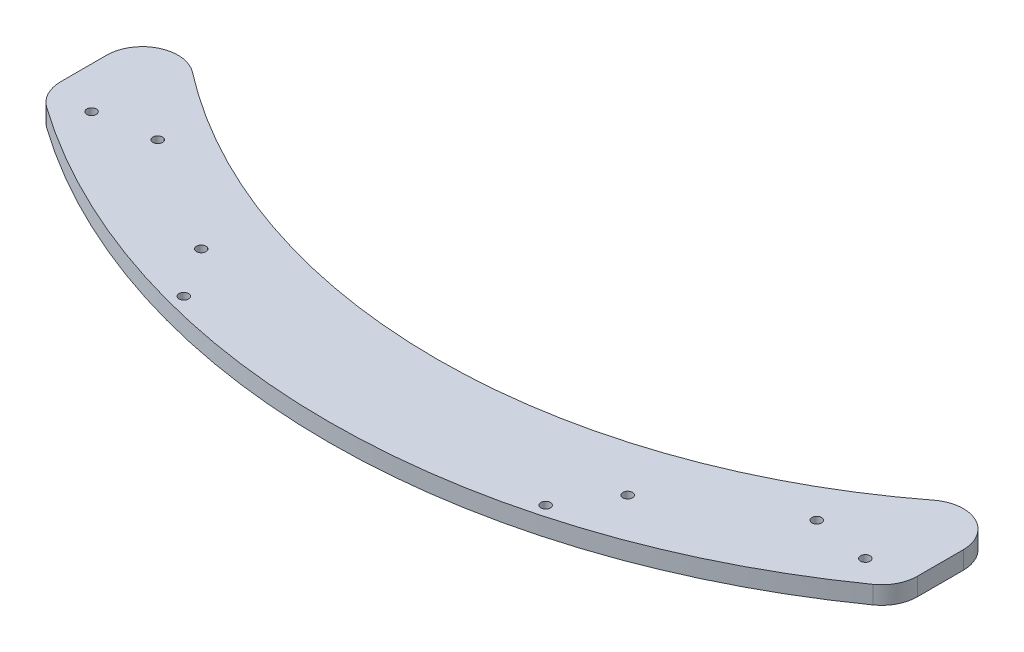
ISO-10303-21;
HEADER;
FILE_DESCRIPTION(('STEP AP214'),'2;1');
FILE_NAME('part.step','',(''),(''),'','','');
FILE_SCHEMA(('AUTOMOTIVE_DESIGN { 1 0 10303 214 1 1 1 1 }'));
ENDSEC;
DATA;
#1=APPLICATION_CONTEXT('core data for automotive mechanical design processes');
#2=APPLICATION_PROTOCOL_DEFINITION('international standard','automotive_design',2000,#1);
#3=PRODUCT_CONTEXT('',#1,'mechanical');
#4=PRODUCT('Part','Part','',(#3));
#5=PRODUCT_RELATED_PRODUCT_CATEGORY('part','',(#4));
#6=PRODUCT_DEFINITION_FORMATION('','',#4);
#7=PRODUCT_DEFINITION_CONTEXT('part definition',#1,'design');
#8=PRODUCT_DEFINITION('design','',#6,#7);
#9=PRODUCT_DEFINITION_SHAPE('','',#8);
#10=(LENGTH_UNIT() NAMED_UNIT(*) SI_UNIT(.MILLI.,.METRE.));
#11=(NAMED_UNIT(*) PLANE_ANGLE_UNIT() SI_UNIT($,.RADIAN.));
#12=(NAMED_UNIT(*) SI_UNIT($,.STERADIAN.) SOLID_ANGLE_UNIT());
#13=UNCERTAINTY_MEASURE_WITH_UNIT(LENGTH_MEASURE(1.E-05),#10,'distance_accuracy_value','');
#14=(GEOMETRIC_REPRESENTATION_CONTEXT(3) GLOBAL_UNCERTAINTY_ASSIGNED_CONTEXT((#13)) GLOBAL_UNIT_ASSIGNED_CONTEXT((#10,
#11,#12)) REPRESENTATION_CONTEXT('',''));
#15=CARTESIAN_POINT('',(0.,0.,0.));
#16=DIRECTION('',(0.,0.,1.));
#17=DIRECTION('',(1.,0.,0.));
#18=AXIS2_PLACEMENT_3D('',#15,#16,#17);
#19=CARTESIAN_POINT('',(139.7,6.35,78.9510702183531));
#20=DIRECTION('',(0.,-1.,0.));
#21=DIRECTION('',(0.,0.,-1.));
#22=AXIS2_PLACEMENT_3D('',#19,#20,#21);
#23=PLANE('',#22);
#24=CARTESIAN_POINT('',(-64.3738884932155,6.35,139.521467890965));
#25=DIRECTION('',(0.,1.,0.));
#26=DIRECTION('',(0.,0.,-1.));
#27=AXIS2_PLACEMENT_3D('',#24,#25,#26);
#28=CIRCLE('',#27,1.70053000000001);
#29=CARTESIAN_POINT('',(-64.3738884932155,6.35,137.820937890965));
#30=VERTEX_POINT('',#29);
#31=EDGE_CURVE('E212',#30,#30,#28,.T.);
#32=ORIENTED_EDGE('',*,*,#31,.F.);
#33=EDGE_LOOP('',(#32));
#34=FACE_BOUND('',#33,.T.);
#35=CARTESIAN_POINT('',(-117.248460029199,6.35,95.9258461633713));
#36=DIRECTION('',(0.,1.,0.));
#37=DIRECTION('',(0.,0.,-1.));
#38=AXIS2_PLACEMENT_3D('',#35,#36,#37);
#39=CIRCLE('',#38,1.70053000000001);
#40=CARTESIAN_POINT('',(-117.248460029199,6.35,94.2253161633713));
#41=VERTEX_POINT('',#40);
#42=EDGE_CURVE('E200',#41,#41,#39,.T.);
#43=ORIENTED_EDGE('',*,*,#42,.F.);
#44=EDGE_LOOP('',(#43));
#45=FACE_BOUND('',#44,.T.);
#46=CARTESIAN_POINT('',(64.3738884932155,6.35,139.521467890965));
#47=DIRECTION('',(0.,1.,0.));
#48=DIRECTION('',(0.,0.,1.));
#49=AXIS2_PLACEMENT_3D('',#46,#47,#48);
#50=CIRCLE('',#49,1.70053000000001);
#51=CARTESIAN_POINT('',(64.3738884932155,6.35,141.221997890965));
#52=VERTEX_POINT('',#51);
#53=EDGE_CURVE('E188',#52,#52,#50,.T.);
#54=ORIENTED_EDGE('',*,*,#53,.F.);
#55=EDGE_LOOP('',(#54));
#56=FACE_BOUND('',#55,.T.);
#57=CARTESIAN_POINT('',(117.248460029199,6.35,95.9258461633713));
#58=DIRECTION('',(0.,1.,0.));
#59=DIRECTION('',(0.,0.,1.));
#60=AXIS2_PLACEMENT_3D('',#57,#58,#59);
#61=CIRCLE('',#60,1.70053000000001);
#62=CARTESIAN_POINT('',(117.248460029199,6.35,97.6263761633713));
#63=VERTEX_POINT('',#62);
#64=EDGE_CURVE('E134',#63,#63,#61,.T.);
#65=ORIENTED_EDGE('',*,*,#64,.F.);
#66=EDGE_LOOP('',(#65));
#67=FACE_BOUND('',#66,.T.);
#68=CARTESIAN_POINT('',(139.7,6.35,78.9510702183531));
#69=DIRECTION('',(0.,1.,0.));
#70=DIRECTION('',(0.,0.,-1.));
#71=AXIS2_PLACEMENT_3D('',#68,#69,#70);
#72=CIRCLE('',#71,12.7);
#73=CARTESIAN_POINT('',(152.4,6.35,78.9510702183531));
#74=VERTEX_POINT('',#73);
#75=CARTESIAN_POINT('',(131.945714909282,6.35,68.8931846188913));
#76=VERTEX_POINT('',#75);
#77=EDGE_CURVE('E145',#74,#76,#72,.T.);
#78=ORIENTED_EDGE('',*,*,#77,.T.);
#79=CARTESIAN_POINT('',(0.,6.35,-102.25024));
#80=DIRECTION('',(0.,-1.,0.));
#81=DIRECTION('',(0.,0.,1.));
#82=AXIS2_PLACEMENT_3D('',#79,#80,#81);
#83=CIRCLE('',#82,216.101234316705);
#84=CARTESIAN_POINT('',(-131.945714909282,6.35,68.8931846188912));
#85=VERTEX_POINT('',#84);
#86=EDGE_CURVE('E93',#76,#85,#83,.T.);
#87=ORIENTED_EDGE('',*,*,#86,.T.);
#88=CARTESIAN_POINT('',(-139.7,6.35,78.9510702183531));
#89=DIRECTION('',(0.,1.,0.));
#90=DIRECTION('',(0.,0.,1.));
#91=AXIS2_PLACEMENT_3D('',#88,#89,#90);
#92=CIRCLE('',#91,12.7);
#93=CARTESIAN_POINT('',(-152.4,6.35,78.9510702183531));
#94=VERTEX_POINT('',#93);
#95=EDGE_CURVE('E160',#85,#94,#92,.T.);
#96=ORIENTED_EDGE('',*,*,#95,.T.);
#97=DIRECTION('',(0.,0.,1.));
#98=VECTOR('',#97,1.);
#99=CARTESIAN_POINT('',(-152.4,6.35,78.9510702183531));
#100=LINE('',#99,#98);
#101=CARTESIAN_POINT('',(-152.4,6.35,95.2942578632854));
#102=VERTEX_POINT('',#101);
#103=EDGE_CURVE('E173',#94,#102,#100,.T.);
#104=ORIENTED_EDGE('',*,*,#103,.T.);
#105=CARTESIAN_POINT('',(-139.7,6.35,95.2942578632855));
#106=DIRECTION('',(0.,1.,0.));
#107=DIRECTION('',(0.,0.,-1.));
#108=AXIS2_PLACEMENT_3D('',#105,#106,#107);
#109=CIRCLE('',#108,12.7);
#110=CARTESIAN_POINT('',(-147.032871420173,6.35,105.663394603401));
#111=VERTEX_POINT('',#110);
#112=EDGE_CURVE('E112',#102,#111,#109,.T.);
#113=ORIENTED_EDGE('',*,*,#112,.T.);
#114=CARTESIAN_POINT('',(0.,6.35,-102.25024));
#115=DIRECTION('',(0.,1.,0.));
#116=DIRECTION('',(0.,0.,1.));
#117=AXIS2_PLACEMENT_3D('',#114,#115,#116);
#118=CIRCLE('',#117,254.65024);
#119=CARTESIAN_POINT('',(147.032871420173,6.35,105.663394603401));
#120=VERTEX_POINT('',#119);
#121=EDGE_CURVE('E106',#111,#120,#118,.T.);
#122=ORIENTED_EDGE('',*,*,#121,.T.);
#123=CARTESIAN_POINT('',(139.7,6.35,95.2942578632854));
#124=DIRECTION('',(0.,1.,0.));
#125=DIRECTION('',(0.,0.,-1.));
#126=AXIS2_PLACEMENT_3D('',#123,#124,#125);
#127=CIRCLE('',#126,12.7);
#128=CARTESIAN_POINT('',(152.4,6.35,95.2942578632854));
#129=VERTEX_POINT('',#128);
#130=EDGE_CURVE('E110',#120,#129,#127,.T.);
#131=ORIENTED_EDGE('',*,*,#130,.T.);
#132=DIRECTION('',(0.,0.,-1.));
#133=VECTOR('',#132,1.);
#134=CARTESIAN_POINT('',(152.4,6.35,78.9510702183531));
#135=LINE('',#134,#133);
#136=EDGE_CURVE('E50',#129,#74,#135,.T.);
#137=ORIENTED_EDGE('',*,*,#136,.T.);
#138=EDGE_LOOP('',(#78,#87,#96,#104,#113,#122,#131,#137));
#139=FACE_BOUND('',#138,.T.);
#140=CARTESIAN_POINT('',(137.667738302992,6.35,99.0669824669048));
#141=DIRECTION('',(0.,1.,0.));
#142=DIRECTION('',(0.,0.,1.));
#143=AXIS2_PLACEMENT_3D('',#140,#141,#142);
#144=CIRCLE('',#143,1.70052999999999);
#145=CARTESIAN_POINT('',(137.667738302992,6.35,100.767512466905));
#146=VERTEX_POINT('',#145);
#147=EDGE_CURVE('E182',#146,#146,#144,.T.);
#148=ORIENTED_EDGE('',*,*,#147,.F.);
#149=EDGE_LOOP('',(#148));
#150=FACE_BOUND('',#149,.T.);
#151=CARTESIAN_POINT('',(75.8677338588999,6.35,121.822498112795));
#152=DIRECTION('',(0.,1.,0.));
#153=DIRECTION('',(0.,0.,1.));
#154=AXIS2_PLACEMENT_3D('',#151,#152,#153);
#155=CIRCLE('',#154,1.70052999999999);
#156=CARTESIAN_POINT('',(75.8677338588999,6.35,123.523028112795));
#157=VERTEX_POINT('',#156);
#158=EDGE_CURVE('E194',#157,#157,#155,.T.);
#159=ORIENTED_EDGE('',*,*,#158,.F.);
#160=EDGE_LOOP('',(#159));
#161=FACE_BOUND('',#160,.T.);
#162=CARTESIAN_POINT('',(-137.667738302992,6.35,99.0669824669048));
#163=DIRECTION('',(0.,1.,0.));
#164=DIRECTION('',(0.,0.,-1.));
#165=AXIS2_PLACEMENT_3D('',#162,#163,#164);
#166=CIRCLE('',#165,1.70052999999999);
#167=CARTESIAN_POINT('',(-137.667738302992,6.35,97.3664524669048));
#168=VERTEX_POINT('',#167);
#169=EDGE_CURVE('E206',#168,#168,#166,.T.);
#170=ORIENTED_EDGE('',*,*,#169,.F.);
#171=EDGE_LOOP('',(#170));
#172=FACE_BOUND('',#171,.T.);
#173=CARTESIAN_POINT('',(-75.8677338588999,6.35,121.822498112795));
#174=DIRECTION('',(0.,1.,0.));
#175=DIRECTION('',(0.,0.,-1.));
#176=AXIS2_PLACEMENT_3D('',#173,#174,#175);
#177=CIRCLE('',#176,1.70052999999999);
#178=CARTESIAN_POINT('',(-75.8677338588999,6.35,120.121968112795));
#179=VERTEX_POINT('',#178);
#180=EDGE_CURVE('E218',#179,#179,#177,.T.);
#181=ORIENTED_EDGE('',*,*,#180,.F.);
#182=EDGE_LOOP('',(#181));
#183=FACE_BOUND('',#182,.T.);
#184=ADVANCED_FACE('F33',(#34,#45,#56,#67,#139,#150,#161,#172,#183),#23,.F.);
#185=CARTESIAN_POINT('',(139.7,0.,78.9510702183531));
#186=DIRECTION('',(0.,-1.,0.));
#187=DIRECTION('',(0.,0.,-1.));
#188=AXIS2_PLACEMENT_3D('',#185,#186,#187);
#189=PLANE('',#188);
#190=CARTESIAN_POINT('',(-64.3738884932155,0.,139.521467890965));
#191=DIRECTION('',(0.,1.,0.));
#192=DIRECTION('',(0.,0.,-1.));
#193=AXIS2_PLACEMENT_3D('',#190,#191,#192);
#194=CIRCLE('',#193,1.70053000000001);
#195=CARTESIAN_POINT('',(-64.3738884932155,0.,137.820937890965));
#196=VERTEX_POINT('',#195);
#197=EDGE_CURVE('E215',#196,#196,#194,.T.);
#198=ORIENTED_EDGE('',*,*,#197,.T.);
#199=EDGE_LOOP('',(#198));
#200=FACE_BOUND('',#199,.T.);
#201=CARTESIAN_POINT('',(-117.248460029199,0.,95.9258461633713));
#202=DIRECTION('',(0.,1.,0.));
#203=DIRECTION('',(0.,0.,-1.));
#204=AXIS2_PLACEMENT_3D('',#201,#202,#203);
#205=CIRCLE('',#204,1.70053000000001);
#206=CARTESIAN_POINT('',(-117.248460029199,0.,94.2253161633713));
#207=VERTEX_POINT('',#206);
#208=EDGE_CURVE('E203',#207,#207,#205,.T.);
#209=ORIENTED_EDGE('',*,*,#208,.T.);
#210=EDGE_LOOP('',(#209));
#211=FACE_BOUND('',#210,.T.);
#212=CARTESIAN_POINT('',(64.3738884932155,0.,139.521467890965));
#213=DIRECTION('',(0.,1.,0.));
#214=DIRECTION('',(0.,0.,1.));
#215=AXIS2_PLACEMENT_3D('',#212,#213,#214);
#216=CIRCLE('',#215,1.70053000000001);
#217=CARTESIAN_POINT('',(64.3738884932155,0.,141.221997890965));
#218=VERTEX_POINT('',#217);
#219=EDGE_CURVE('E191',#218,#218,#216,.T.);
#220=ORIENTED_EDGE('',*,*,#219,.T.);
#221=EDGE_LOOP('',(#220));
#222=FACE_BOUND('',#221,.T.);
#223=CARTESIAN_POINT('',(117.248460029199,0.,95.9258461633713));
#224=DIRECTION('',(0.,1.,0.));
#225=DIRECTION('',(0.,0.,1.));
#226=AXIS2_PLACEMENT_3D('',#223,#224,#225);
#227=CIRCLE('',#226,1.70053000000001);
#228=CARTESIAN_POINT('',(117.248460029199,0.,97.6263761633713));
#229=VERTEX_POINT('',#228);
#230=EDGE_CURVE('E179',#229,#229,#227,.T.);
#231=ORIENTED_EDGE('',*,*,#230,.T.);
#232=EDGE_LOOP('',(#231));
#233=FACE_BOUND('',#232,.T.);
#234=CARTESIAN_POINT('',(139.7,0.,78.9510702183531));
#235=DIRECTION('',(0.,1.,0.));
#236=DIRECTION('',(0.,0.,-1.));
#237=AXIS2_PLACEMENT_3D('',#234,#235,#236);
#238=CIRCLE('',#237,12.7);
#239=CARTESIAN_POINT('',(152.4,0.,78.9510702183531));
#240=VERTEX_POINT('',#239);
#241=CARTESIAN_POINT('',(131.945714909282,0.,68.8931846188913));
#242=VERTEX_POINT('',#241);
#243=EDGE_CURVE('E130',#240,#242,#238,.T.);
#244=ORIENTED_EDGE('',*,*,#243,.F.);
#245=DIRECTION('',(0.,0.,-1.));
#246=VECTOR('',#245,1.);
#247=CARTESIAN_POINT('',(152.4,0.,78.9510702183531));
#248=LINE('',#247,#246);
#249=CARTESIAN_POINT('',(152.4,0.,95.2942578632854));
#250=VERTEX_POINT('',#249);
#251=EDGE_CURVE('E85',#250,#240,#248,.T.);
#252=ORIENTED_EDGE('',*,*,#251,.F.);
#253=CARTESIAN_POINT('',(139.7,0.,95.2942578632854));
#254=DIRECTION('',(0.,1.,0.));
#255=DIRECTION('',(0.,0.,-1.));
#256=AXIS2_PLACEMENT_3D('',#253,#254,#255);
#257=CIRCLE('',#256,12.7);
#258=CARTESIAN_POINT('',(147.032871420173,0.,105.663394603401));
#259=VERTEX_POINT('',#258);
#260=EDGE_CURVE('E79',#259,#250,#257,.T.);
#261=ORIENTED_EDGE('',*,*,#260,.F.);
#262=CARTESIAN_POINT('',(0.,0.,-102.25024));
#263=DIRECTION('',(0.,1.,0.));
#264=DIRECTION('',(0.,0.,1.));
#265=AXIS2_PLACEMENT_3D('',#262,#263,#264);
#266=CIRCLE('',#265,254.65024);
#267=CARTESIAN_POINT('',(-147.032871420173,0.,105.663394603401));
#268=VERTEX_POINT('',#267);
#269=EDGE_CURVE('E120',#268,#259,#266,.T.);
#270=ORIENTED_EDGE('',*,*,#269,.F.);
#271=CARTESIAN_POINT('',(-139.7,0.,95.2942578632855));
#272=DIRECTION('',(0.,1.,0.));
#273=DIRECTION('',(0.,0.,-1.));
#274=AXIS2_PLACEMENT_3D('',#271,#272,#273);
#275=CIRCLE('',#274,12.7);
#276=CARTESIAN_POINT('',(-152.4,0.,95.2942578632854));
#277=VERTEX_POINT('',#276);
#278=EDGE_CURVE('E140',#277,#268,#275,.T.);
#279=ORIENTED_EDGE('',*,*,#278,.F.);
#280=DIRECTION('',(0.,0.,1.));
#281=VECTOR('',#280,1.);
#282=CARTESIAN_POINT('',(-152.4,0.,78.9510702183531));
#283=LINE('',#282,#281);
#284=CARTESIAN_POINT('',(-152.4,0.,78.9510702183531));
#285=VERTEX_POINT('',#284);
#286=EDGE_CURVE('E138',#285,#277,#283,.T.);
#287=ORIENTED_EDGE('',*,*,#286,.F.);
#288=CARTESIAN_POINT('',(-139.7,0.,78.9510702183531));
#289=DIRECTION('',(0.,1.,0.));
#290=DIRECTION('',(0.,0.,1.));
#291=AXIS2_PLACEMENT_3D('',#288,#289,#290);
#292=CIRCLE('',#291,12.7);
#293=CARTESIAN_POINT('',(-131.945714909282,0.,68.8931846188912));
#294=VERTEX_POINT('',#293);
#295=EDGE_CURVE('E136',#294,#285,#292,.T.);
#296=ORIENTED_EDGE('',*,*,#295,.F.);
#297=CARTESIAN_POINT('',(0.,0.,-102.25024));
#298=DIRECTION('',(0.,-1.,0.));
#299=DIRECTION('',(0.,0.,1.));
#300=AXIS2_PLACEMENT_3D('',#297,#298,#299);
#301=CIRCLE('',#300,216.101234316705);
#302=EDGE_CURVE('E133',#242,#294,#301,.T.);
#303=ORIENTED_EDGE('',*,*,#302,.F.);
#304=EDGE_LOOP('',(#244,#252,#261,#270,#279,#287,#296,#303));
#305=FACE_BOUND('',#304,.T.);
#306=CARTESIAN_POINT('',(137.667738302992,0.,99.0669824669048));
#307=DIRECTION('',(0.,1.,0.));
#308=DIRECTION('',(0.,0.,1.));
#309=AXIS2_PLACEMENT_3D('',#306,#307,#308);
#310=CIRCLE('',#309,1.70052999999999);
#311=CARTESIAN_POINT('',(137.667738302992,0.,100.767512466905));
#312=VERTEX_POINT('',#311);
#313=EDGE_CURVE('E185',#312,#312,#310,.T.);
#314=ORIENTED_EDGE('',*,*,#313,.T.);
#315=EDGE_LOOP('',(#314));
#316=FACE_BOUND('',#315,.T.);
#317=CARTESIAN_POINT('',(75.8677338588999,0.,121.822498112795));
#318=DIRECTION('',(0.,1.,0.));
#319=DIRECTION('',(0.,0.,1.));
#320=AXIS2_PLACEMENT_3D('',#317,#318,#319);
#321=CIRCLE('',#320,1.70052999999999);
#322=CARTESIAN_POINT('',(75.8677338588999,0.,123.523028112795));
#323=VERTEX_POINT('',#322);
#324=EDGE_CURVE('E197',#323,#323,#321,.T.);
#325=ORIENTED_EDGE('',*,*,#324,.T.);
#326=EDGE_LOOP('',(#325));
#327=FACE_BOUND('',#326,.T.);
#328=CARTESIAN_POINT('',(-137.667738302992,0.,99.0669824669048));
#329=DIRECTION('',(0.,1.,0.));
#330=DIRECTION('',(0.,0.,-1.));
#331=AXIS2_PLACEMENT_3D('',#328,#329,#330);
#332=CIRCLE('',#331,1.70052999999999);
#333=CARTESIAN_POINT('',(-137.667738302992,0.,97.3664524669048));
#334=VERTEX_POINT('',#333);
#335=EDGE_CURVE('E209',#334,#334,#332,.T.);
#336=ORIENTED_EDGE('',*,*,#335,.T.);
#337=EDGE_LOOP('',(#336));
#338=FACE_BOUND('',#337,.T.);
#339=CARTESIAN_POINT('',(-75.8677338588999,0.,121.822498112795));
#340=DIRECTION('',(0.,1.,0.));
#341=DIRECTION('',(0.,0.,-1.));
#342=AXIS2_PLACEMENT_3D('',#339,#340,#341);
#343=CIRCLE('',#342,1.70052999999999);
#344=CARTESIAN_POINT('',(-75.8677338588999,0.,120.121968112795));
#345=VERTEX_POINT('',#344);
#346=EDGE_CURVE('E221',#345,#345,#343,.T.);
#347=ORIENTED_EDGE('',*,*,#346,.T.);
#348=EDGE_LOOP('',(#347));
#349=FACE_BOUND('',#348,.T.);
#350=ADVANCED_FACE('F164',(#200,#211,#222,#233,#305,#316,#327,#338,#349),#189,.T.);
#351=CARTESIAN_POINT('',(139.7,6.35,78.9510702183531));
#352=DIRECTION('',(0.,-1.,0.));
#353=DIRECTION('',(0.,0.,-1.));
#354=AXIS2_PLACEMENT_3D('',#351,#352,#353);
#355=CYLINDRICAL_SURFACE('',#354,12.7);
#356=ORIENTED_EDGE('',*,*,#243,.T.);
#357=DIRECTION('',(0.,-1.,0.));
#358=VECTOR('',#357,1.);
#359=CARTESIAN_POINT('',(131.945714909282,6.35,68.8931846188913));
#360=LINE('',#359,#358);
#361=EDGE_CURVE('E11',#76,#242,#360,.T.);
#362=ORIENTED_EDGE('',*,*,#361,.F.);
#363=ORIENTED_EDGE('',*,*,#77,.F.);
#364=DIRECTION('',(0.,-1.,0.));
#365=VECTOR('',#364,1.);
#366=CARTESIAN_POINT('',(152.4,6.35,78.9510702183531));
#367=LINE('',#366,#365);
#368=EDGE_CURVE('E126',#74,#240,#367,.T.);
#369=ORIENTED_EDGE('',*,*,#368,.T.);
#370=EDGE_LOOP('',(#356,#362,#363,#369));
#371=FACE_BOUND('',#370,.T.);
#372=ADVANCED_FACE('F35',(#371),#355,.T.);
#373=CARTESIAN_POINT('',(0.,6.35,-102.25024));
#374=DIRECTION('',(0.,-1.,0.));
#375=DIRECTION('',(0.,0.,-1.));
#376=AXIS2_PLACEMENT_3D('',#373,#374,#375);
#377=CYLINDRICAL_SURFACE('',#376,216.101234316705);
#378=ORIENTED_EDGE('',*,*,#302,.T.);
#379=DIRECTION('',(0.,-1.,0.));
#380=VECTOR('',#379,1.);
#381=CARTESIAN_POINT('',(-131.945714909282,6.35,68.8931846188912));
#382=LINE('',#381,#380);
#383=EDGE_CURVE('E42',#85,#294,#382,.T.);
#384=ORIENTED_EDGE('',*,*,#383,.F.);
#385=ORIENTED_EDGE('',*,*,#86,.F.);
#386=ORIENTED_EDGE('',*,*,#361,.T.);
#387=EDGE_LOOP('',(#378,#384,#385,#386));
#388=FACE_BOUND('',#387,.T.);
#389=ADVANCED_FACE('F256',(#388),#377,.F.);
#390=CARTESIAN_POINT('',(-139.7,6.35,78.9510702183531));
#391=DIRECTION('',(0.,-1.,0.));
#392=DIRECTION('',(0.,0.,-1.));
#393=AXIS2_PLACEMENT_3D('',#390,#391,#392);
#394=CYLINDRICAL_SURFACE('',#393,12.7);
#395=ORIENTED_EDGE('',*,*,#295,.T.);
#396=DIRECTION('',(0.,-1.,0.));
#397=VECTOR('',#396,1.);
#398=CARTESIAN_POINT('',(-152.4,6.35,78.9510702183531));
#399=LINE('',#398,#397);
#400=EDGE_CURVE('E152',#94,#285,#399,.T.);
#401=ORIENTED_EDGE('',*,*,#400,.F.);
#402=ORIENTED_EDGE('',*,*,#95,.F.);
#403=ORIENTED_EDGE('',*,*,#383,.T.);
#404=EDGE_LOOP('',(#395,#401,#402,#403));
#405=FACE_BOUND('',#404,.T.);
#406=ADVANCED_FACE('F158',(#405),#394,.T.);
#407=CARTESIAN_POINT('',(-152.4,6.35,78.9510702183531));
#408=DIRECTION('',(1.,0.,0.));
#409=DIRECTION('',(0.,0.,-1.));
#410=AXIS2_PLACEMENT_3D('',#407,#408,#409);
#411=PLANE('',#410);
#412=ORIENTED_EDGE('',*,*,#286,.T.);
#413=DIRECTION('',(0.,-1.,0.));
#414=VECTOR('',#413,1.);
#415=CARTESIAN_POINT('',(-152.4,6.35,95.2942578632854));
#416=LINE('',#415,#414);
#417=EDGE_CURVE('E149',#102,#277,#416,.T.);
#418=ORIENTED_EDGE('',*,*,#417,.F.);
#419=ORIENTED_EDGE('',*,*,#103,.F.);
#420=ORIENTED_EDGE('',*,*,#400,.T.);
#421=EDGE_LOOP('',(#412,#418,#419,#420));
#422=FACE_BOUND('',#421,.T.);
#423=ADVANCED_FACE('F169',(#422),#411,.F.);
#424=CARTESIAN_POINT('',(-139.7,6.35,95.2942578632855));
#425=DIRECTION('',(0.,-1.,0.));
#426=DIRECTION('',(0.,0.,-1.));
#427=AXIS2_PLACEMENT_3D('',#424,#425,#426);
#428=CYLINDRICAL_SURFACE('',#427,12.7);
#429=ORIENTED_EDGE('',*,*,#278,.T.);
#430=DIRECTION('',(0.,-1.,0.));
#431=VECTOR('',#430,1.);
#432=CARTESIAN_POINT('',(-147.032871420173,6.35,105.663394603401));
#433=LINE('',#432,#431);
#434=EDGE_CURVE('E121',#111,#268,#433,.T.);
#435=ORIENTED_EDGE('',*,*,#434,.F.);
#436=ORIENTED_EDGE('',*,*,#112,.F.);
#437=ORIENTED_EDGE('',*,*,#417,.T.);
#438=EDGE_LOOP('',(#429,#435,#436,#437));
#439=FACE_BOUND('',#438,.T.);
#440=ADVANCED_FACE('F172',(#439),#428,.T.);
#441=CARTESIAN_POINT('',(0.,6.35,-102.25024));
#442=DIRECTION('',(0.,-1.,0.));
#443=DIRECTION('',(0.,0.,-1.));
#444=AXIS2_PLACEMENT_3D('',#441,#442,#443);
#445=CYLINDRICAL_SURFACE('',#444,254.65024);
#446=ORIENTED_EDGE('',*,*,#269,.T.);
#447=DIRECTION('',(0.,-1.,0.));
#448=VECTOR('',#447,1.);
#449=CARTESIAN_POINT('',(147.032871420173,6.35,105.663394603401));
#450=LINE('',#449,#448);
#451=EDGE_CURVE('E117',#120,#259,#450,.T.);
#452=ORIENTED_EDGE('',*,*,#451,.F.);
#453=ORIENTED_EDGE('',*,*,#121,.F.);
#454=ORIENTED_EDGE('',*,*,#434,.T.);
#455=EDGE_LOOP('',(#446,#452,#453,#454));
#456=FACE_BOUND('',#455,.T.);
#457=ADVANCED_FACE('F118',(#456),#445,.T.);
#458=CARTESIAN_POINT('',(139.7,6.35,95.2942578632854));
#459=DIRECTION('',(0.,-1.,0.));
#460=DIRECTION('',(0.,0.,-1.));
#461=AXIS2_PLACEMENT_3D('',#458,#459,#460);
#462=CYLINDRICAL_SURFACE('',#461,12.7);
#463=ORIENTED_EDGE('',*,*,#260,.T.);
#464=DIRECTION('',(0.,-1.,0.));
#465=VECTOR('',#464,1.);
#466=CARTESIAN_POINT('',(152.4,6.35,95.2942578632854));
#467=LINE('',#466,#465);
#468=EDGE_CURVE('E122',#129,#250,#467,.T.);
#469=ORIENTED_EDGE('',*,*,#468,.F.);
#470=ORIENTED_EDGE('',*,*,#130,.F.);
#471=ORIENTED_EDGE('',*,*,#451,.T.);
#472=EDGE_LOOP('',(#463,#469,#470,#471));
#473=FACE_BOUND('',#472,.T.);
#474=ADVANCED_FACE('F124',(#473),#462,.T.);
#475=CARTESIAN_POINT('',(152.4,6.35,78.9510702183531));
#476=DIRECTION('',(-1.,0.,0.));
#477=DIRECTION('',(0.,0.,1.));
#478=AXIS2_PLACEMENT_3D('',#475,#476,#477);
#479=PLANE('',#478);
#480=ORIENTED_EDGE('',*,*,#251,.T.);
#481=ORIENTED_EDGE('',*,*,#368,.F.);
#482=ORIENTED_EDGE('',*,*,#136,.F.);
#483=ORIENTED_EDGE('',*,*,#468,.T.);
#484=EDGE_LOOP('',(#480,#481,#482,#483));
#485=FACE_BOUND('',#484,.T.);
#486=ADVANCED_FACE('F244',(#485),#479,.F.);
#487=CARTESIAN_POINT('',(117.248460029199,6.35,95.9258461633713));
#488=DIRECTION('',(0.,-1.,0.));
#489=DIRECTION('',(0.,0.,-1.));
#490=AXIS2_PLACEMENT_3D('',#487,#488,#489);
#491=CYLINDRICAL_SURFACE('',#490,1.70053000000001);
#492=ORIENTED_EDGE('',*,*,#64,.T.);
#493=EDGE_LOOP('',(#492));
#494=FACE_BOUND('',#493,.T.);
#495=ORIENTED_EDGE('',*,*,#230,.F.);
#496=EDGE_LOOP('',(#495));
#497=FACE_BOUND('',#496,.T.);
#498=ADVANCED_FACE('F241',(#494,#497),#491,.F.);
#499=CARTESIAN_POINT('',(137.667738302992,6.35,99.0669824669048));
#500=DIRECTION('',(0.,-1.,0.));
#501=DIRECTION('',(0.,0.,-1.));
#502=AXIS2_PLACEMENT_3D('',#499,#500,#501);
#503=CYLINDRICAL_SURFACE('',#502,1.70052999999999);
#504=ORIENTED_EDGE('',*,*,#147,.T.);
#505=EDGE_LOOP('',(#504));
#506=FACE_BOUND('',#505,.T.);
#507=ORIENTED_EDGE('',*,*,#313,.F.);
#508=EDGE_LOOP('',(#507));
#509=FACE_BOUND('',#508,.T.);
#510=ADVANCED_FACE('F320',(#506,#509),#503,.F.);
#511=CARTESIAN_POINT('',(64.3738884932155,6.35,139.521467890965));
#512=DIRECTION('',(0.,-1.,0.));
#513=DIRECTION('',(0.,0.,-1.));
#514=AXIS2_PLACEMENT_3D('',#511,#512,#513);
#515=CYLINDRICAL_SURFACE('',#514,1.70053000000001);
#516=ORIENTED_EDGE('',*,*,#53,.T.);
#517=EDGE_LOOP('',(#516));
#518=FACE_BOUND('',#517,.T.);
#519=ORIENTED_EDGE('',*,*,#219,.F.);
#520=EDGE_LOOP('',(#519));
#521=FACE_BOUND('',#520,.T.);
#522=ADVANCED_FACE('F328',(#518,#521),#515,.F.);
#523=CARTESIAN_POINT('',(75.8677338588999,6.35,121.822498112795));
#524=DIRECTION('',(0.,-1.,0.));
#525=DIRECTION('',(0.,0.,-1.));
#526=AXIS2_PLACEMENT_3D('',#523,#524,#525);
#527=CYLINDRICAL_SURFACE('',#526,1.70052999999999);
#528=ORIENTED_EDGE('',*,*,#158,.T.);
#529=EDGE_LOOP('',(#528));
#530=FACE_BOUND('',#529,.T.);
#531=ORIENTED_EDGE('',*,*,#324,.F.);
#532=EDGE_LOOP('',(#531));
#533=FACE_BOUND('',#532,.T.);
#534=ADVANCED_FACE('F336',(#530,#533),#527,.F.);
#535=CARTESIAN_POINT('',(-117.248460029199,6.35,95.9258461633713));
#536=DIRECTION('',(0.,-1.,0.));
#537=DIRECTION('',(0.,0.,-1.));
#538=AXIS2_PLACEMENT_3D('',#535,#536,#537);
#539=CYLINDRICAL_SURFACE('',#538,1.70053000000001);
#540=ORIENTED_EDGE('',*,*,#42,.T.);
#541=EDGE_LOOP('',(#540));
#542=FACE_BOUND('',#541,.T.);
#543=ORIENTED_EDGE('',*,*,#208,.F.);
#544=EDGE_LOOP('',(#543));
#545=FACE_BOUND('',#544,.T.);
#546=ADVANCED_FACE('F345',(#542,#545),#539,.F.);
#547=CARTESIAN_POINT('',(-137.667738302992,6.35,99.0669824669048));
#548=DIRECTION('',(0.,-1.,0.));
#549=DIRECTION('',(0.,0.,-1.));
#550=AXIS2_PLACEMENT_3D('',#547,#548,#549);
#551=CYLINDRICAL_SURFACE('',#550,1.70052999999999);
#552=ORIENTED_EDGE('',*,*,#169,.T.);
#553=EDGE_LOOP('',(#552));
#554=FACE_BOUND('',#553,.T.);
#555=ORIENTED_EDGE('',*,*,#335,.F.);
#556=EDGE_LOOP('',(#555));
#557=FACE_BOUND('',#556,.T.);
#558=ADVANCED_FACE('F354',(#554,#557),#551,.F.);
#559=CARTESIAN_POINT('',(-64.3738884932155,6.35,139.521467890965));
#560=DIRECTION('',(0.,-1.,0.));
#561=DIRECTION('',(0.,0.,-1.));
#562=AXIS2_PLACEMENT_3D('',#559,#560,#561);
#563=CYLINDRICAL_SURFACE('',#562,1.70053000000001);
#564=ORIENTED_EDGE('',*,*,#31,.T.);
#565=EDGE_LOOP('',(#564));
#566=FACE_BOUND('',#565,.T.);
#567=ORIENTED_EDGE('',*,*,#197,.F.);
#568=EDGE_LOOP('',(#567));
#569=FACE_BOUND('',#568,.T.);
#570=ADVANCED_FACE('F363',(#566,#569),#563,.F.);
#571=CARTESIAN_POINT('',(-75.8677338588999,6.35,121.822498112795));
#572=DIRECTION('',(0.,-1.,0.));
#573=DIRECTION('',(0.,0.,-1.));
#574=AXIS2_PLACEMENT_3D('',#571,#572,#573);
#575=CYLINDRICAL_SURFACE('',#574,1.70052999999999);
#576=ORIENTED_EDGE('',*,*,#180,.T.);
#577=EDGE_LOOP('',(#576));
#578=FACE_BOUND('',#577,.T.);
#579=ORIENTED_EDGE('',*,*,#346,.F.);
#580=EDGE_LOOP('',(#579));
#581=FACE_BOUND('',#580,.T.);
#582=ADVANCED_FACE('F227',(#578,#581),#575,.F.);
#583=CLOSED_SHELL('',(#184,#350,#372,#389,#406,#423,#440,#457,#474,#486,#498,#510,#522,#534,
#546,#558,#570,#582));
#584=MANIFOLD_SOLID_BREP('B2',#583);
#585=ADVANCED_BREP_SHAPE_REPRESENTATION('',(#18,#584),#14);
#586=SHAPE_DEFINITION_REPRESENTATION(#9,#585);
ENDSEC;
END-ISO-10303-21;
